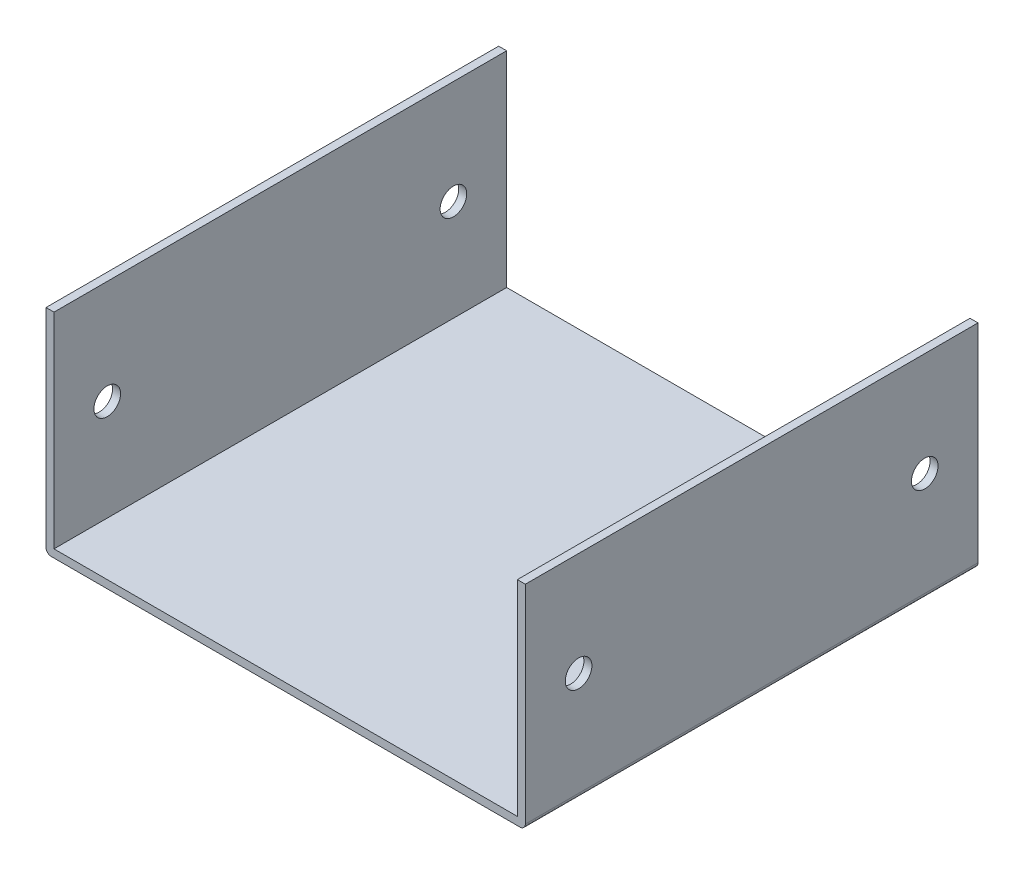
ISO-10303-21;
HEADER;
FILE_DESCRIPTION(('STEP AP214'),'2;1');
FILE_NAME('part.step','',(''),(''),'','','');
FILE_SCHEMA(('AUTOMOTIVE_DESIGN { 1 0 10303 214 1 1 1 1 }'));
ENDSEC;
DATA;
#1=APPLICATION_CONTEXT('core data for automotive mechanical design processes');
#2=APPLICATION_PROTOCOL_DEFINITION('international standard','automotive_design',2000,#1);
#3=PRODUCT_CONTEXT('',#1,'mechanical');
#4=PRODUCT('Part','Part','',(#3));
#5=PRODUCT_RELATED_PRODUCT_CATEGORY('part','',(#4));
#6=PRODUCT_DEFINITION_FORMATION('','',#4);
#7=PRODUCT_DEFINITION_CONTEXT('part definition',#1,'design');
#8=PRODUCT_DEFINITION('design','',#6,#7);
#9=PRODUCT_DEFINITION_SHAPE('','',#8);
#10=(LENGTH_UNIT() NAMED_UNIT(*) SI_UNIT(.MILLI.,.METRE.));
#11=(NAMED_UNIT(*) PLANE_ANGLE_UNIT() SI_UNIT($,.RADIAN.));
#12=(NAMED_UNIT(*) SI_UNIT($,.STERADIAN.) SOLID_ANGLE_UNIT());
#13=UNCERTAINTY_MEASURE_WITH_UNIT(LENGTH_MEASURE(1.E-05),#10,'distance_accuracy_value','');
#14=(GEOMETRIC_REPRESENTATION_CONTEXT(3) GLOBAL_UNCERTAINTY_ASSIGNED_CONTEXT((#13)) GLOBAL_UNIT_ASSIGNED_CONTEXT((#10,
#11,#12)) REPRESENTATION_CONTEXT('',''));
#15=CARTESIAN_POINT('',(0.,0.,0.));
#16=DIRECTION('',(0.,0.,1.));
#17=DIRECTION('',(1.,0.,0.));
#18=AXIS2_PLACEMENT_3D('',#15,#16,#17);
#19=CARTESIAN_POINT('',(0.,35.7341679085941,170.));
#20=DIRECTION('',(0.,1.,0.));
#21=DIRECTION('',(0.,0.,1.));
#22=AXIS2_PLACEMENT_3D('',#19,#20,#21);
#23=PLANE('',#22);
#24=DIRECTION('',(1.,0.,0.));
#25=VECTOR('',#24,1.);
#26=CARTESIAN_POINT('',(0.,35.7341679085941,0.));
#27=LINE('',#26,#25);
#28=CARTESIAN_POINT('',(130.45680410664,35.7341679085941,0.));
#29=VERTEX_POINT('',#28);
#30=CARTESIAN_POINT('',(133.45680410664,35.7341679085941,0.));
#31=VERTEX_POINT('',#30);
#32=EDGE_CURVE('E125',#29,#31,#27,.T.);
#33=ORIENTED_EDGE('',*,*,#32,.F.);
#34=DIRECTION('',(0.,0.,-1.));
#35=VECTOR('',#34,1.);
#36=CARTESIAN_POINT('',(130.45680410664,35.7341679085941,170.));
#37=LINE('',#36,#35);
#38=CARTESIAN_POINT('',(130.45680410664,35.7341679085941,170.));
#39=VERTEX_POINT('',#38);
#40=EDGE_CURVE('E120',#39,#29,#37,.T.);
#41=ORIENTED_EDGE('',*,*,#40,.F.);
#42=DIRECTION('',(1.,0.,0.));
#43=VECTOR('',#42,1.);
#44=CARTESIAN_POINT('',(0.,35.7341679085941,170.));
#45=LINE('',#44,#43);
#46=CARTESIAN_POINT('',(133.45680410664,35.7341679085941,170.));
#47=VERTEX_POINT('',#46);
#48=EDGE_CURVE('E123',#39,#47,#45,.T.);
#49=ORIENTED_EDGE('',*,*,#48,.T.);
#50=DIRECTION('',(0.,0.,-1.));
#51=VECTOR('',#50,1.);
#52=CARTESIAN_POINT('',(133.45680410664,35.7341679085941,170.));
#53=LINE('',#52,#51);
#54=EDGE_CURVE('E162',#47,#31,#53,.T.);
#55=ORIENTED_EDGE('',*,*,#54,.T.);
#56=EDGE_LOOP('',(#33,#41,#49,#55));
#57=FACE_BOUND('',#56,.T.);
#58=ADVANCED_FACE('F43',(#57),#23,.T.);
#59=CARTESIAN_POINT('',(130.45680410664,0.,170.));
#60=DIRECTION('',(-1.,0.,0.));
#61=DIRECTION('',(0.,0.,1.));
#62=AXIS2_PLACEMENT_3D('',#59,#60,#61);
#63=PLANE('',#62);
#64=CARTESIAN_POINT('',(130.45680410664,-3.26583209140587,150.));
#65=DIRECTION('',(-1.,0.,0.));
#66=DIRECTION('',(0.,0.,1.));
#67=AXIS2_PLACEMENT_3D('',#64,#65,#66);
#68=CIRCLE('',#67,4.99999999999999);
#69=CARTESIAN_POINT('',(130.45680410664,-3.26583209140587,155.));
#70=VERTEX_POINT('',#69);
#71=EDGE_CURVE('E165',#70,#70,#68,.T.);
#72=ORIENTED_EDGE('',*,*,#71,.F.);
#73=EDGE_LOOP('',(#72));
#74=FACE_BOUND('',#73,.T.);
#75=CARTESIAN_POINT('',(130.45680410664,-3.26583209140587,20.));
#76=DIRECTION('',(-1.,0.,0.));
#77=DIRECTION('',(0.,0.,1.));
#78=AXIS2_PLACEMENT_3D('',#75,#76,#77);
#79=CIRCLE('',#78,5.);
#80=CARTESIAN_POINT('',(130.45680410664,-3.26583209140587,25.));
#81=VERTEX_POINT('',#80);
#82=EDGE_CURVE('E284',#81,#81,#79,.T.);
#83=ORIENTED_EDGE('',*,*,#82,.F.);
#84=EDGE_LOOP('',(#83));
#85=FACE_BOUND('',#84,.T.);
#86=DIRECTION('',(0.,1.,0.));
#87=VECTOR('',#86,1.);
#88=CARTESIAN_POINT('',(130.45680410664,0.,0.));
#89=LINE('',#88,#87);
#90=CARTESIAN_POINT('',(130.45680410664,-41.2658320914059,0.));
#91=VERTEX_POINT('',#90);
#92=EDGE_CURVE('E164',#91,#29,#89,.T.);
#93=ORIENTED_EDGE('',*,*,#92,.F.);
#94=DIRECTION('',(0.,0.,-1.));
#95=VECTOR('',#94,1.);
#96=CARTESIAN_POINT('',(130.45680410664,-41.2658320914059,170.));
#97=LINE('',#96,#95);
#98=CARTESIAN_POINT('',(130.45680410664,-41.2658320914059,170.));
#99=VERTEX_POINT('',#98);
#100=EDGE_CURVE('E131',#99,#91,#97,.T.);
#101=ORIENTED_EDGE('',*,*,#100,.F.);
#102=DIRECTION('',(0.,1.,0.));
#103=VECTOR('',#102,1.);
#104=CARTESIAN_POINT('',(130.45680410664,0.,170.));
#105=LINE('',#104,#103);
#106=EDGE_CURVE('E137',#99,#39,#105,.T.);
#107=ORIENTED_EDGE('',*,*,#106,.T.);
#108=ORIENTED_EDGE('',*,*,#40,.T.);
#109=EDGE_LOOP('',(#93,#101,#107,#108));
#110=FACE_BOUND('',#109,.T.);
#111=ADVANCED_FACE('F144',(#74,#85,#110),#63,.T.);
#112=CARTESIAN_POINT('',(0.,-41.2658320914059,170.));
#113=DIRECTION('',(0.,1.,0.));
#114=DIRECTION('',(0.,0.,1.));
#115=AXIS2_PLACEMENT_3D('',#112,#113,#114);
#116=PLANE('',#115);
#117=DIRECTION('',(1.,0.,0.));
#118=VECTOR('',#117,1.);
#119=CARTESIAN_POINT('',(0.,-41.2658320914059,0.));
#120=LINE('',#119,#118);
#121=CARTESIAN_POINT('',(-43.5431958933598,-41.2658320914059,0.));
#122=VERTEX_POINT('',#121);
#123=EDGE_CURVE('E167',#122,#91,#120,.T.);
#124=ORIENTED_EDGE('',*,*,#123,.F.);
#125=DIRECTION('',(0.,0.,-1.));
#126=VECTOR('',#125,1.);
#127=CARTESIAN_POINT('',(-43.5431958933598,-41.2658320914059,170.));
#128=LINE('',#127,#126);
#129=CARTESIAN_POINT('',(-43.5431958933598,-41.2658320914059,170.));
#130=VERTEX_POINT('',#129);
#131=EDGE_CURVE('E187',#130,#122,#128,.T.);
#132=ORIENTED_EDGE('',*,*,#131,.F.);
#133=DIRECTION('',(1.,0.,0.));
#134=VECTOR('',#133,1.);
#135=CARTESIAN_POINT('',(0.,-41.2658320914059,170.));
#136=LINE('',#135,#134);
#137=EDGE_CURVE('E145',#130,#99,#136,.T.);
#138=ORIENTED_EDGE('',*,*,#137,.T.);
#139=ORIENTED_EDGE('',*,*,#100,.T.);
#140=EDGE_LOOP('',(#124,#132,#138,#139));
#141=FACE_BOUND('',#140,.T.);
#142=ADVANCED_FACE('F210',(#141),#116,.T.);
#143=CARTESIAN_POINT('',(-43.5431958933598,0.,170.));
#144=DIRECTION('',(1.,0.,0.));
#145=DIRECTION('',(0.,1.,0.));
#146=AXIS2_PLACEMENT_3D('',#143,#144,#145);
#147=PLANE('',#146);
#148=CARTESIAN_POINT('',(-43.5431958933599,-3.26583209140587,150.));
#149=DIRECTION('',(1.,0.,0.));
#150=DIRECTION('',(0.,1.,0.));
#151=AXIS2_PLACEMENT_3D('',#148,#149,#150);
#152=CIRCLE('',#151,4.99999999999999);
#153=CARTESIAN_POINT('',(-43.5431958933599,1.73416790859412,150.));
#154=VERTEX_POINT('',#153);
#155=EDGE_CURVE('E289',#154,#154,#152,.T.);
#156=ORIENTED_EDGE('',*,*,#155,.F.);
#157=EDGE_LOOP('',(#156));
#158=FACE_BOUND('',#157,.T.);
#159=CARTESIAN_POINT('',(-43.5431958933599,-3.26583209140587,20.));
#160=DIRECTION('',(1.,0.,0.));
#161=DIRECTION('',(0.,1.,0.));
#162=AXIS2_PLACEMENT_3D('',#159,#160,#161);
#163=CIRCLE('',#162,5.);
#164=CARTESIAN_POINT('',(-43.5431958933599,1.73416790859413,20.));
#165=VERTEX_POINT('',#164);
#166=EDGE_CURVE('E281',#165,#165,#163,.T.);
#167=ORIENTED_EDGE('',*,*,#166,.F.);
#168=EDGE_LOOP('',(#167));
#169=FACE_BOUND('',#168,.T.);
#170=DIRECTION('',(0.,-1.,0.));
#171=VECTOR('',#170,1.);
#172=CARTESIAN_POINT('',(-43.5431958933598,0.,0.));
#173=LINE('',#172,#171);
#174=CARTESIAN_POINT('',(-43.5431958933599,35.7341679085941,0.));
#175=VERTEX_POINT('',#174);
#176=EDGE_CURVE('E170',#175,#122,#173,.T.);
#177=ORIENTED_EDGE('',*,*,#176,.F.);
#178=DIRECTION('',(0.,0.,-1.));
#179=VECTOR('',#178,1.);
#180=CARTESIAN_POINT('',(-43.5431958933599,35.7341679085941,170.));
#181=LINE('',#180,#179);
#182=CARTESIAN_POINT('',(-43.5431958933599,35.7341679085941,170.));
#183=VERTEX_POINT('',#182);
#184=EDGE_CURVE('E185',#183,#175,#181,.T.);
#185=ORIENTED_EDGE('',*,*,#184,.F.);
#186=DIRECTION('',(0.,-1.,0.));
#187=VECTOR('',#186,1.);
#188=CARTESIAN_POINT('',(-43.5431958933598,0.,170.));
#189=LINE('',#188,#187);
#190=EDGE_CURVE('E147',#183,#130,#189,.T.);
#191=ORIENTED_EDGE('',*,*,#190,.T.);
#192=ORIENTED_EDGE('',*,*,#131,.T.);
#193=EDGE_LOOP('',(#177,#185,#191,#192));
#194=FACE_BOUND('',#193,.T.);
#195=ADVANCED_FACE('F214',(#158,#169,#194),#147,.T.);
#196=CARTESIAN_POINT('',(0.,35.7341679085941,170.));
#197=DIRECTION('',(0.,1.,0.));
#198=DIRECTION('',(0.,0.,1.));
#199=AXIS2_PLACEMENT_3D('',#196,#197,#198);
#200=PLANE('',#199);
#201=DIRECTION('',(1.,0.,0.));
#202=VECTOR('',#201,1.);
#203=CARTESIAN_POINT('',(0.,35.7341679085941,0.));
#204=LINE('',#203,#202);
#205=CARTESIAN_POINT('',(-46.5431958933598,35.7341679085941,0.));
#206=VERTEX_POINT('',#205);
#207=EDGE_CURVE('E173',#206,#175,#204,.T.);
#208=ORIENTED_EDGE('',*,*,#207,.F.);
#209=DIRECTION('',(0.,0.,-1.));
#210=VECTOR('',#209,1.);
#211=CARTESIAN_POINT('',(-46.5431958933598,35.7341679085941,170.));
#212=LINE('',#211,#210);
#213=CARTESIAN_POINT('',(-46.5431958933598,35.7341679085941,170.));
#214=VERTEX_POINT('',#213);
#215=EDGE_CURVE('E183',#214,#206,#212,.T.);
#216=ORIENTED_EDGE('',*,*,#215,.F.);
#217=DIRECTION('',(1.,0.,0.));
#218=VECTOR('',#217,1.);
#219=CARTESIAN_POINT('',(0.,35.7341679085941,170.));
#220=LINE('',#219,#218);
#221=EDGE_CURVE('E153',#214,#183,#220,.T.);
#222=ORIENTED_EDGE('',*,*,#221,.T.);
#223=ORIENTED_EDGE('',*,*,#184,.T.);
#224=EDGE_LOOP('',(#208,#216,#222,#223));
#225=FACE_BOUND('',#224,.T.);
#226=ADVANCED_FACE('F217',(#225),#200,.T.);
#227=CARTESIAN_POINT('',(-46.5431958933598,0.,170.));
#228=DIRECTION('',(1.,0.,0.));
#229=DIRECTION('',(0.,1.,0.));
#230=AXIS2_PLACEMENT_3D('',#227,#228,#229);
#231=PLANE('',#230);
#232=CARTESIAN_POINT('',(-46.5431958933599,-3.26583209140587,150.));
#233=DIRECTION('',(1.,0.,0.));
#234=DIRECTION('',(0.,1.,0.));
#235=AXIS2_PLACEMENT_3D('',#232,#233,#234);
#236=CIRCLE('',#235,4.99999999999999);
#237=CARTESIAN_POINT('',(-46.5431958933599,1.73416790859412,150.));
#238=VERTEX_POINT('',#237);
#239=EDGE_CURVE('E287',#238,#238,#236,.T.);
#240=ORIENTED_EDGE('',*,*,#239,.T.);
#241=EDGE_LOOP('',(#240));
#242=FACE_BOUND('',#241,.T.);
#243=CARTESIAN_POINT('',(-46.5431958933599,-3.26583209140587,20.));
#244=DIRECTION('',(1.,0.,0.));
#245=DIRECTION('',(0.,1.,0.));
#246=AXIS2_PLACEMENT_3D('',#243,#244,#245);
#247=CIRCLE('',#246,5.);
#248=CARTESIAN_POINT('',(-46.5431958933599,1.73416790859413,20.));
#249=VERTEX_POINT('',#248);
#250=EDGE_CURVE('E276',#249,#249,#247,.T.);
#251=ORIENTED_EDGE('',*,*,#250,.T.);
#252=EDGE_LOOP('',(#251));
#253=FACE_BOUND('',#252,.T.);
#254=DIRECTION('',(0.,-1.,0.));
#255=VECTOR('',#254,1.);
#256=CARTESIAN_POINT('',(-46.5431958933598,0.,0.));
#257=LINE('',#256,#255);
#258=CARTESIAN_POINT('',(-46.5431958933598,-42.2658320914059,0.));
#259=VERTEX_POINT('',#258);
#260=EDGE_CURVE('E176',#206,#259,#257,.T.);
#261=ORIENTED_EDGE('',*,*,#260,.T.);
#262=DIRECTION('',(0.,0.,-1.));
#263=VECTOR('',#262,1.);
#264=CARTESIAN_POINT('',(-46.5431958933598,-42.2658320914059,170.));
#265=LINE('',#264,#263);
#266=CARTESIAN_POINT('',(-46.5431958933598,-42.2658320914059,170.));
#267=VERTEX_POINT('',#266);
#268=EDGE_CURVE('E194',#259,#267,#265,.F.);
#269=ORIENTED_EDGE('',*,*,#268,.T.);
#270=DIRECTION('',(0.,-1.,0.));
#271=VECTOR('',#270,1.);
#272=CARTESIAN_POINT('',(-46.5431958933598,0.,170.));
#273=LINE('',#272,#271);
#274=EDGE_CURVE('E156',#214,#267,#273,.T.);
#275=ORIENTED_EDGE('',*,*,#274,.F.);
#276=ORIENTED_EDGE('',*,*,#215,.T.);
#277=EDGE_LOOP('',(#261,#269,#275,#276));
#278=FACE_BOUND('',#277,.T.);
#279=ADVANCED_FACE('F227',(#242,#253,#278),#231,.F.);
#280=CARTESIAN_POINT('',(0.,-44.2658320914059,170.));
#281=DIRECTION('',(0.,1.,0.));
#282=DIRECTION('',(0.,0.,1.));
#283=AXIS2_PLACEMENT_3D('',#280,#281,#282);
#284=PLANE('',#283);
#285=DIRECTION('',(1.,0.,0.));
#286=VECTOR('',#285,1.);
#287=CARTESIAN_POINT('',(0.,-44.2658320914059,0.));
#288=LINE('',#287,#286);
#289=CARTESIAN_POINT('',(-44.5431958933598,-44.2658320914059,0.));
#290=VERTEX_POINT('',#289);
#291=CARTESIAN_POINT('',(131.45680410664,-44.2658320914059,0.));
#292=VERTEX_POINT('',#291);
#293=EDGE_CURVE('E179',#290,#292,#288,.T.);
#294=ORIENTED_EDGE('',*,*,#293,.T.);
#295=DIRECTION('',(0.,0.,-1.));
#296=VECTOR('',#295,1.);
#297=CARTESIAN_POINT('',(131.45680410664,-44.2658320914059,170.));
#298=LINE('',#297,#296);
#299=CARTESIAN_POINT('',(131.45680410664,-44.2658320914059,170.));
#300=VERTEX_POINT('',#299);
#301=EDGE_CURVE('E51',#292,#300,#298,.F.);
#302=ORIENTED_EDGE('',*,*,#301,.T.);
#303=DIRECTION('',(1.,0.,0.));
#304=VECTOR('',#303,1.);
#305=CARTESIAN_POINT('',(0.,-44.2658320914059,170.));
#306=LINE('',#305,#304);
#307=CARTESIAN_POINT('',(-44.5431958933598,-44.2658320914059,170.));
#308=VERTEX_POINT('',#307);
#309=EDGE_CURVE('E159',#308,#300,#306,.T.);
#310=ORIENTED_EDGE('',*,*,#309,.F.);
#311=DIRECTION('',(0.,0.,-1.));
#312=VECTOR('',#311,1.);
#313=CARTESIAN_POINT('',(-44.5431958933598,-44.2658320914059,170.));
#314=LINE('',#313,#312);
#315=EDGE_CURVE('E130',#308,#290,#314,.T.);
#316=ORIENTED_EDGE('',*,*,#315,.T.);
#317=EDGE_LOOP('',(#294,#302,#310,#316));
#318=FACE_BOUND('',#317,.T.);
#319=ADVANCED_FACE('F225',(#318),#284,.F.);
#320=CARTESIAN_POINT('',(133.45680410664,0.,170.));
#321=DIRECTION('',(-1.,0.,0.));
#322=DIRECTION('',(0.,0.,1.));
#323=AXIS2_PLACEMENT_3D('',#320,#321,#322);
#324=PLANE('',#323);
#325=CARTESIAN_POINT('',(133.45680410664,-3.26583209140587,150.));
#326=DIRECTION('',(1.,0.,0.));
#327=DIRECTION('',(0.,0.,-1.));
#328=AXIS2_PLACEMENT_3D('',#325,#326,#327);
#329=CIRCLE('',#328,4.99999999999999);
#330=CARTESIAN_POINT('',(133.45680410664,-3.26583209140587,145.));
#331=VERTEX_POINT('',#330);
#332=EDGE_CURVE('E270',#331,#331,#329,.T.);
#333=ORIENTED_EDGE('',*,*,#332,.F.);
#334=EDGE_LOOP('',(#333));
#335=FACE_BOUND('',#334,.T.);
#336=CARTESIAN_POINT('',(133.45680410664,-3.26583209140587,20.));
#337=DIRECTION('',(1.,0.,0.));
#338=DIRECTION('',(0.,0.,-1.));
#339=AXIS2_PLACEMENT_3D('',#336,#337,#338);
#340=CIRCLE('',#339,5.);
#341=CARTESIAN_POINT('',(133.45680410664,-3.26583209140587,15.));
#342=VERTEX_POINT('',#341);
#343=EDGE_CURVE('E273',#342,#342,#340,.T.);
#344=ORIENTED_EDGE('',*,*,#343,.F.);
#345=EDGE_LOOP('',(#344));
#346=FACE_BOUND('',#345,.T.);
#347=DIRECTION('',(0.,1.,0.));
#348=VECTOR('',#347,1.);
#349=CARTESIAN_POINT('',(133.45680410664,0.,170.));
#350=LINE('',#349,#348);
#351=CARTESIAN_POINT('',(133.45680410664,-42.2658320914059,170.));
#352=VERTEX_POINT('',#351);
#353=EDGE_CURVE('E140',#352,#47,#350,.T.);
#354=ORIENTED_EDGE('',*,*,#353,.F.);
#355=DIRECTION('',(0.,0.,-1.));
#356=VECTOR('',#355,1.);
#357=CARTESIAN_POINT('',(133.45680410664,-42.2658320914059,170.));
#358=LINE('',#357,#356);
#359=CARTESIAN_POINT('',(133.45680410664,-42.2658320914059,0.));
#360=VERTEX_POINT('',#359);
#361=EDGE_CURVE('E198',#352,#360,#358,.T.);
#362=ORIENTED_EDGE('',*,*,#361,.T.);
#363=DIRECTION('',(0.,1.,0.));
#364=VECTOR('',#363,1.);
#365=CARTESIAN_POINT('',(133.45680410664,0.,0.));
#366=LINE('',#365,#364);
#367=EDGE_CURVE('E142',#360,#31,#366,.T.);
#368=ORIENTED_EDGE('',*,*,#367,.T.);
#369=ORIENTED_EDGE('',*,*,#54,.F.);
#370=EDGE_LOOP('',(#354,#362,#368,#369));
#371=FACE_BOUND('',#370,.T.);
#372=ADVANCED_FACE('F203',(#335,#346,#371),#324,.F.);
#373=CARTESIAN_POINT('',(0.,0.,170.));
#374=DIRECTION('',(0.,0.,1.));
#375=DIRECTION('',(1.,0.,0.));
#376=AXIS2_PLACEMENT_3D('',#373,#374,#375);
#377=PLANE('',#376);
#378=ORIENTED_EDGE('',*,*,#309,.T.);
#379=CARTESIAN_POINT('',(131.45680410664,-42.2658320914059,170.));
#380=DIRECTION('',(0.,0.,1.));
#381=DIRECTION('',(1.,0.,0.));
#382=AXIS2_PLACEMENT_3D('',#379,#380,#381);
#383=CIRCLE('',#382,2.);
#384=EDGE_CURVE('E11',#300,#352,#383,.T.);
#385=ORIENTED_EDGE('',*,*,#384,.T.);
#386=ORIENTED_EDGE('',*,*,#353,.T.);
#387=ORIENTED_EDGE('',*,*,#48,.F.);
#388=ORIENTED_EDGE('',*,*,#106,.F.);
#389=ORIENTED_EDGE('',*,*,#137,.F.);
#390=ORIENTED_EDGE('',*,*,#190,.F.);
#391=ORIENTED_EDGE('',*,*,#221,.F.);
#392=ORIENTED_EDGE('',*,*,#274,.T.);
#393=CARTESIAN_POINT('',(-44.5431958933598,-42.2658320914059,170.));
#394=DIRECTION('',(0.,0.,1.));
#395=DIRECTION('',(1.,0.,0.));
#396=AXIS2_PLACEMENT_3D('',#393,#394,#395);
#397=CIRCLE('',#396,2.);
#398=EDGE_CURVE('E196',#267,#308,#397,.T.);
#399=ORIENTED_EDGE('',*,*,#398,.T.);
#400=EDGE_LOOP('',(#378,#385,#386,#387,#388,#389,#390,#391,#392,#399));
#401=FACE_BOUND('',#400,.T.);
#402=ADVANCED_FACE('F135',(#401),#377,.T.);
#403=CARTESIAN_POINT('',(0.,0.,0.));
#404=DIRECTION('',(0.,0.,1.));
#405=DIRECTION('',(1.,0.,0.));
#406=AXIS2_PLACEMENT_3D('',#403,#404,#405);
#407=PLANE('',#406);
#408=ORIENTED_EDGE('',*,*,#367,.F.);
#409=CARTESIAN_POINT('',(131.45680410664,-42.2658320914059,0.));
#410=DIRECTION('',(0.,0.,1.));
#411=DIRECTION('',(1.,0.,0.));
#412=AXIS2_PLACEMENT_3D('',#409,#410,#411);
#413=CIRCLE('',#412,2.);
#414=EDGE_CURVE('E65',#360,#292,#413,.F.);
#415=ORIENTED_EDGE('',*,*,#414,.T.);
#416=ORIENTED_EDGE('',*,*,#293,.F.);
#417=CARTESIAN_POINT('',(-44.5431958933598,-42.2658320914059,0.));
#418=DIRECTION('',(0.,0.,1.));
#419=DIRECTION('',(1.,0.,0.));
#420=AXIS2_PLACEMENT_3D('',#417,#418,#419);
#421=CIRCLE('',#420,2.);
#422=EDGE_CURVE('E192',#290,#259,#421,.F.);
#423=ORIENTED_EDGE('',*,*,#422,.T.);
#424=ORIENTED_EDGE('',*,*,#260,.F.);
#425=ORIENTED_EDGE('',*,*,#207,.T.);
#426=ORIENTED_EDGE('',*,*,#176,.T.);
#427=ORIENTED_EDGE('',*,*,#123,.T.);
#428=ORIENTED_EDGE('',*,*,#92,.T.);
#429=ORIENTED_EDGE('',*,*,#32,.T.);
#430=EDGE_LOOP('',(#408,#415,#416,#423,#424,#425,#426,#427,#428,#429));
#431=FACE_BOUND('',#430,.T.);
#432=ADVANCED_FACE('F206',(#431),#407,.F.);
#433=CARTESIAN_POINT('',(-44.5431958933598,-42.2658320914059,170.));
#434=DIRECTION('',(0.,0.,-1.));
#435=DIRECTION('',(-1.,0.,0.));
#436=AXIS2_PLACEMENT_3D('',#433,#434,#435);
#437=CYLINDRICAL_SURFACE('',#436,2.);
#438=ORIENTED_EDGE('',*,*,#398,.F.);
#439=ORIENTED_EDGE('',*,*,#268,.F.);
#440=ORIENTED_EDGE('',*,*,#422,.F.);
#441=ORIENTED_EDGE('',*,*,#315,.F.);
#442=EDGE_LOOP('',(#438,#439,#440,#441));
#443=FACE_BOUND('',#442,.T.);
#444=ADVANCED_FACE('F224',(#443),#437,.T.);
#445=CARTESIAN_POINT('',(131.45680410664,-42.2658320914059,170.));
#446=DIRECTION('',(0.,0.,-1.));
#447=DIRECTION('',(-1.,0.,0.));
#448=AXIS2_PLACEMENT_3D('',#445,#446,#447);
#449=CYLINDRICAL_SURFACE('',#448,2.);
#450=ORIENTED_EDGE('',*,*,#384,.F.);
#451=ORIENTED_EDGE('',*,*,#301,.F.);
#452=ORIENTED_EDGE('',*,*,#414,.F.);
#453=ORIENTED_EDGE('',*,*,#361,.F.);
#454=EDGE_LOOP('',(#450,#451,#452,#453));
#455=FACE_BOUND('',#454,.T.);
#456=ADVANCED_FACE('F45',(#455),#449,.T.);
#457=CARTESIAN_POINT('',(-321.54319589336,-3.26583209140587,20.));
#458=DIRECTION('',(1.,0.,0.));
#459=DIRECTION('',(0.,0.,-1.));
#460=AXIS2_PLACEMENT_3D('',#457,#458,#459);
#461=CYLINDRICAL_SURFACE('',#460,5.);
#462=ORIENTED_EDGE('',*,*,#82,.T.);
#463=EDGE_LOOP('',(#462));
#464=FACE_BOUND('',#463,.T.);
#465=ORIENTED_EDGE('',*,*,#343,.T.);
#466=EDGE_LOOP('',(#465));
#467=FACE_BOUND('',#466,.T.);
#468=ADVANCED_FACE('F254',(#464,#467),#461,.F.);
#469=CARTESIAN_POINT('',(-321.54319589336,-3.26583209140587,150.));
#470=DIRECTION('',(1.,0.,0.));
#471=DIRECTION('',(0.,0.,-1.));
#472=AXIS2_PLACEMENT_3D('',#469,#470,#471);
#473=CYLINDRICAL_SURFACE('',#472,4.99999999999999);
#474=ORIENTED_EDGE('',*,*,#71,.T.);
#475=EDGE_LOOP('',(#474));
#476=FACE_BOUND('',#475,.T.);
#477=ORIENTED_EDGE('',*,*,#332,.T.);
#478=EDGE_LOOP('',(#477));
#479=FACE_BOUND('',#478,.T.);
#480=ADVANCED_FACE('F294',(#476,#479),#473,.F.);
#481=ORIENTED_EDGE('',*,*,#166,.T.);
#482=EDGE_LOOP('',(#481));
#483=FACE_BOUND('',#482,.T.);
#484=ORIENTED_EDGE('',*,*,#250,.F.);
#485=EDGE_LOOP('',(#484));
#486=FACE_BOUND('',#485,.T.);
#487=ADVANCED_FACE('F299',(#483,#486),#461,.F.);
#488=ORIENTED_EDGE('',*,*,#155,.T.);
#489=EDGE_LOOP('',(#488));
#490=FACE_BOUND('',#489,.T.);
#491=ORIENTED_EDGE('',*,*,#239,.F.);
#492=EDGE_LOOP('',(#491));
#493=FACE_BOUND('',#492,.T.);
#494=ADVANCED_FACE('F304',(#490,#493),#473,.F.);
#495=CLOSED_SHELL('',(#58,#111,#142,#195,#226,#279,#319,#372,#402,#432,#444,#456,#468,#480,#487,#494));
#496=MANIFOLD_SOLID_BREP('B2',#495);
#497=ADVANCED_BREP_SHAPE_REPRESENTATION('',(#18,#496),#14);
#498=SHAPE_DEFINITION_REPRESENTATION(#9,#497);
ENDSEC;
END-ISO-10303-21;
